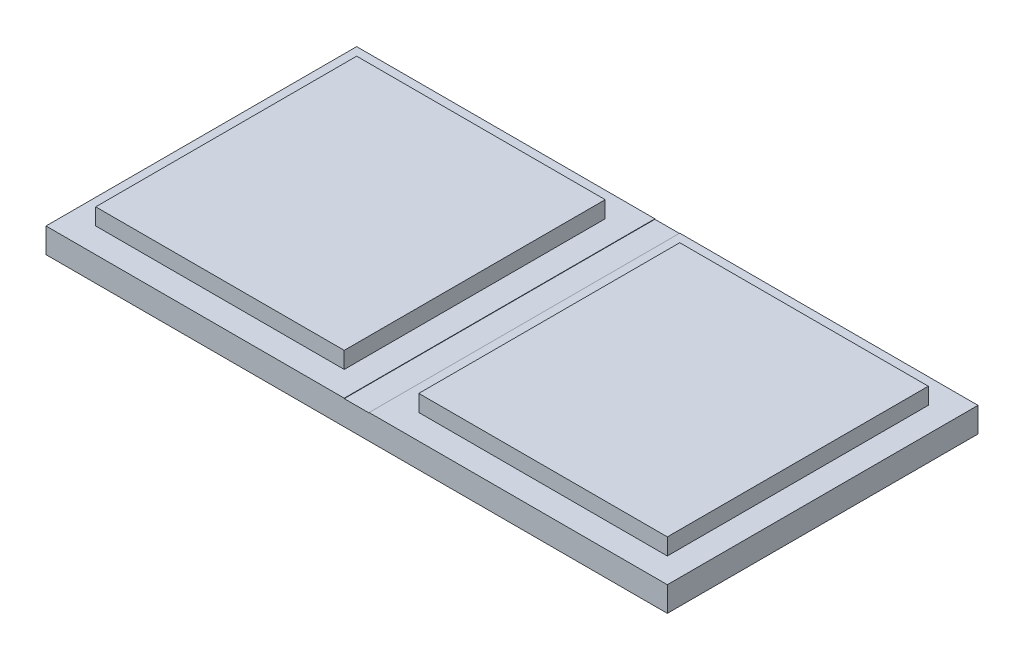
ISO-10303-21;
HEADER;
FILE_DESCRIPTION(('STEP AP214'),'2;1');
FILE_NAME('part.step','',(''),(''),'','','');
FILE_SCHEMA(('AUTOMOTIVE_DESIGN { 1 0 10303 214 1 1 1 1 }'));
ENDSEC;
DATA;
#1=APPLICATION_CONTEXT('core data for automotive mechanical design processes');
#2=APPLICATION_PROTOCOL_DEFINITION('international standard','automotive_design',2000,#1);
#3=PRODUCT_CONTEXT('',#1,'mechanical');
#4=PRODUCT('Part','Part','',(#3));
#5=PRODUCT_RELATED_PRODUCT_CATEGORY('part','',(#4));
#6=PRODUCT_DEFINITION_FORMATION('','',#4);
#7=PRODUCT_DEFINITION_CONTEXT('part definition',#1,'design');
#8=PRODUCT_DEFINITION('design','',#6,#7);
#9=PRODUCT_DEFINITION_SHAPE('','',#8);
#10=(LENGTH_UNIT() NAMED_UNIT(*) SI_UNIT(.MILLI.,.METRE.));
#11=(NAMED_UNIT(*) PLANE_ANGLE_UNIT() SI_UNIT($,.RADIAN.));
#12=(NAMED_UNIT(*) SI_UNIT($,.STERADIAN.) SOLID_ANGLE_UNIT());
#13=UNCERTAINTY_MEASURE_WITH_UNIT(LENGTH_MEASURE(1.E-05),#10,'distance_accuracy_value','');
#14=(GEOMETRIC_REPRESENTATION_CONTEXT(3) GLOBAL_UNCERTAINTY_ASSIGNED_CONTEXT((#13)) GLOBAL_UNIT_ASSIGNED_CONTEXT((#10,
#11,#12)) REPRESENTATION_CONTEXT('',''));
#15=CARTESIAN_POINT('',(0.,0.,0.));
#16=DIRECTION('',(0.,0.,1.));
#17=DIRECTION('',(1.,0.,0.));
#18=AXIS2_PLACEMENT_3D('',#15,#16,#17);
#19=CARTESIAN_POINT('',(0.,1.2,0.));
#20=DIRECTION('',(0.,-1.,0.));
#21=DIRECTION('',(0.,0.,-1.));
#22=AXIS2_PLACEMENT_3D('',#19,#20,#21);
#23=PLANE('',#22);
#24=DIRECTION('',(-1.,0.,0.));
#25=VECTOR('',#24,1.);
#26=CARTESIAN_POINT('',(-15.,1.2,-7.5));
#27=LINE('',#26,#25);
#28=CARTESIAN_POINT('',(15.,1.2,-7.5));
#29=VERTEX_POINT('',#28);
#30=CARTESIAN_POINT('',(0.6,1.2,-7.5));
#31=VERTEX_POINT('',#30);
#32=EDGE_CURVE('E243',#29,#31,#27,.T.);
#33=ORIENTED_EDGE('',*,*,#32,.T.);
#34=DIRECTION('',(0.,0.,-1.));
#35=VECTOR('',#34,1.);
#36=CARTESIAN_POINT('',(0.6,1.2,7.5));
#37=LINE('',#36,#35);
#38=CARTESIAN_POINT('',(0.6,1.2,7.5));
#39=VERTEX_POINT('',#38);
#40=EDGE_CURVE('E211',#39,#31,#37,.T.);
#41=ORIENTED_EDGE('',*,*,#40,.F.);
#42=DIRECTION('',(1.,0.,0.));
#43=VECTOR('',#42,1.);
#44=CARTESIAN_POINT('',(-15.,1.2,7.5));
#45=LINE('',#44,#43);
#46=CARTESIAN_POINT('',(15.,1.2,7.5));
#47=VERTEX_POINT('',#46);
#48=EDGE_CURVE('E248',#39,#47,#45,.T.);
#49=ORIENTED_EDGE('',*,*,#48,.T.);
#50=DIRECTION('',(0.,0.,-1.));
#51=VECTOR('',#50,1.);
#52=CARTESIAN_POINT('',(15.,1.2,7.5));
#53=LINE('',#52,#51);
#54=EDGE_CURVE('E238',#47,#29,#53,.T.);
#55=ORIENTED_EDGE('',*,*,#54,.T.);
#56=EDGE_LOOP('',(#33,#41,#49,#55));
#57=FACE_BOUND('',#56,.T.);
#58=DIRECTION('',(0.,0.,-1.));
#59=VECTOR('',#58,1.);
#60=CARTESIAN_POINT('',(13.8,1.2,6.3));
#61=LINE('',#60,#59);
#62=CARTESIAN_POINT('',(13.8,1.2,6.3));
#63=VERTEX_POINT('',#62);
#64=CARTESIAN_POINT('',(13.8,1.2,-6.3));
#65=VERTEX_POINT('',#64);
#66=EDGE_CURVE('E172',#63,#65,#61,.T.);
#67=ORIENTED_EDGE('',*,*,#66,.F.);
#68=DIRECTION('',(1.,0.,0.));
#69=VECTOR('',#68,1.);
#70=CARTESIAN_POINT('',(1.8,1.2,6.3));
#71=LINE('',#70,#69);
#72=CARTESIAN_POINT('',(1.8,1.2,6.3));
#73=VERTEX_POINT('',#72);
#74=EDGE_CURVE('E169',#73,#63,#71,.T.);
#75=ORIENTED_EDGE('',*,*,#74,.F.);
#76=DIRECTION('',(0.,0.,1.));
#77=VECTOR('',#76,1.);
#78=CARTESIAN_POINT('',(1.8,1.2,-6.3));
#79=LINE('',#78,#77);
#80=CARTESIAN_POINT('',(1.8,1.2,-6.3));
#81=VERTEX_POINT('',#80);
#82=EDGE_CURVE('E59',#81,#73,#79,.T.);
#83=ORIENTED_EDGE('',*,*,#82,.F.);
#84=DIRECTION('',(-1.,0.,0.));
#85=VECTOR('',#84,1.);
#86=CARTESIAN_POINT('',(13.8,1.2,-6.3));
#87=LINE('',#86,#85);
#88=EDGE_CURVE('E54',#65,#81,#87,.T.);
#89=ORIENTED_EDGE('',*,*,#88,.F.);
#90=EDGE_LOOP('',(#67,#75,#83,#89));
#91=FACE_BOUND('',#90,.T.);
#92=ADVANCED_FACE('F39',(#57,#91),#23,.F.);
#93=CARTESIAN_POINT('',(-15.,1.2,7.5));
#94=VERTEX_POINT('',#93);
#95=CARTESIAN_POINT('',(-0.6,1.2,7.5));
#96=VERTEX_POINT('',#95);
#97=EDGE_CURVE('E249',#94,#96,#45,.T.);
#98=ORIENTED_EDGE('',*,*,#97,.T.);
#99=DIRECTION('',(0.,0.,1.));
#100=VECTOR('',#99,1.);
#101=CARTESIAN_POINT('',(-0.6,1.2,7.5));
#102=LINE('',#101,#100);
#103=CARTESIAN_POINT('',(-0.6,1.2,-7.5));
#104=VERTEX_POINT('',#103);
#105=EDGE_CURVE('E216',#104,#96,#102,.T.);
#106=ORIENTED_EDGE('',*,*,#105,.F.);
#107=CARTESIAN_POINT('',(-15.,1.2,-7.5));
#108=VERTEX_POINT('',#107);
#109=EDGE_CURVE('E241',#104,#108,#27,.T.);
#110=ORIENTED_EDGE('',*,*,#109,.T.);
#111=DIRECTION('',(0.,0.,1.));
#112=VECTOR('',#111,1.);
#113=CARTESIAN_POINT('',(-15.,1.2,7.5));
#114=LINE('',#113,#112);
#115=EDGE_CURVE('E246',#108,#94,#114,.T.);
#116=ORIENTED_EDGE('',*,*,#115,.T.);
#117=EDGE_LOOP('',(#98,#106,#110,#116));
#118=FACE_BOUND('',#117,.T.);
#119=DIRECTION('',(0.,0.,1.));
#120=VECTOR('',#119,1.);
#121=CARTESIAN_POINT('',(-13.8,1.2,-6.3));
#122=LINE('',#121,#120);
#123=CARTESIAN_POINT('',(-13.8,1.2,-6.3));
#124=VERTEX_POINT('',#123);
#125=CARTESIAN_POINT('',(-13.8,1.2,6.3));
#126=VERTEX_POINT('',#125);
#127=EDGE_CURVE('E173',#124,#126,#122,.T.);
#128=ORIENTED_EDGE('',*,*,#127,.F.);
#129=DIRECTION('',(-1.,0.,0.));
#130=VECTOR('',#129,1.);
#131=CARTESIAN_POINT('',(-1.8,1.2,-6.3));
#132=LINE('',#131,#130);
#133=CARTESIAN_POINT('',(-1.8,1.2,-6.3));
#134=VERTEX_POINT('',#133);
#135=EDGE_CURVE('E186',#134,#124,#132,.T.);
#136=ORIENTED_EDGE('',*,*,#135,.F.);
#137=DIRECTION('',(0.,0.,-1.));
#138=VECTOR('',#137,1.);
#139=CARTESIAN_POINT('',(-1.8,1.2,6.3));
#140=LINE('',#139,#138);
#141=CARTESIAN_POINT('',(-1.8,1.2,6.3));
#142=VERTEX_POINT('',#141);
#143=EDGE_CURVE('E195',#142,#134,#140,.T.);
#144=ORIENTED_EDGE('',*,*,#143,.F.);
#145=DIRECTION('',(1.,0.,0.));
#146=VECTOR('',#145,1.);
#147=CARTESIAN_POINT('',(-13.8,1.2,6.3));
#148=LINE('',#147,#146);
#149=EDGE_CURVE('E176',#126,#142,#148,.T.);
#150=ORIENTED_EDGE('',*,*,#149,.F.);
#151=EDGE_LOOP('',(#128,#136,#144,#150));
#152=FACE_BOUND('',#151,.T.);
#153=ADVANCED_FACE('F299',(#118,#152),#23,.F.);
#154=CARTESIAN_POINT('',(15.,1.2,7.5));
#155=DIRECTION('',(-1.,0.,0.));
#156=DIRECTION('',(0.,0.,1.));
#157=AXIS2_PLACEMENT_3D('',#154,#155,#156);
#158=PLANE('',#157);
#159=DIRECTION('',(0.,0.,-1.));
#160=VECTOR('',#159,1.);
#161=CARTESIAN_POINT('',(15.,0.,7.5));
#162=LINE('',#161,#160);
#163=CARTESIAN_POINT('',(15.,0.,7.5));
#164=VERTEX_POINT('',#163);
#165=CARTESIAN_POINT('',(15.,0.,-7.5));
#166=VERTEX_POINT('',#165);
#167=EDGE_CURVE('E230',#164,#166,#162,.T.);
#168=ORIENTED_EDGE('',*,*,#167,.T.);
#169=DIRECTION('',(0.,-1.,0.));
#170=VECTOR('',#169,1.);
#171=CARTESIAN_POINT('',(15.,1.2,-7.5));
#172=LINE('',#171,#170);
#173=EDGE_CURVE('E11',#29,#166,#172,.T.);
#174=ORIENTED_EDGE('',*,*,#173,.F.);
#175=ORIENTED_EDGE('',*,*,#54,.F.);
#176=DIRECTION('',(0.,-1.,0.));
#177=VECTOR('',#176,1.);
#178=CARTESIAN_POINT('',(15.,1.2,7.5));
#179=LINE('',#178,#177);
#180=EDGE_CURVE('E252',#47,#164,#179,.T.);
#181=ORIENTED_EDGE('',*,*,#180,.T.);
#182=EDGE_LOOP('',(#168,#174,#175,#181));
#183=FACE_BOUND('',#182,.T.);
#184=ADVANCED_FACE('F41',(#183),#158,.F.);
#185=CARTESIAN_POINT('',(-15.,1.2,-7.5));
#186=DIRECTION('',(0.,0.,1.));
#187=DIRECTION('',(1.,0.,0.));
#188=AXIS2_PLACEMENT_3D('',#185,#186,#187);
#189=PLANE('',#188);
#190=DIRECTION('',(-1.,0.,0.));
#191=VECTOR('',#190,1.);
#192=CARTESIAN_POINT('',(-0.6,1.18,-7.5));
#193=LINE('',#192,#191);
#194=CARTESIAN_POINT('',(0.6,1.18,-7.5));
#195=VERTEX_POINT('',#194);
#196=CARTESIAN_POINT('',(-0.6,1.18,-7.5));
#197=VERTEX_POINT('',#196);
#198=EDGE_CURVE('E215',#195,#197,#193,.T.);
#199=ORIENTED_EDGE('',*,*,#198,.F.);
#200=DIRECTION('',(0.,1.,0.));
#201=VECTOR('',#200,1.);
#202=CARTESIAN_POINT('',(0.6,1.18,-7.5));
#203=LINE('',#202,#201);
#204=EDGE_CURVE('E225',#195,#31,#203,.T.);
#205=ORIENTED_EDGE('',*,*,#204,.T.);
#206=ORIENTED_EDGE('',*,*,#32,.F.);
#207=ORIENTED_EDGE('',*,*,#173,.T.);
#208=DIRECTION('',(-1.,0.,0.));
#209=VECTOR('',#208,1.);
#210=CARTESIAN_POINT('',(-15.,0.,-7.5));
#211=LINE('',#210,#209);
#212=CARTESIAN_POINT('',(-15.,0.,-7.5));
#213=VERTEX_POINT('',#212);
#214=EDGE_CURVE('E255',#166,#213,#211,.T.);
#215=ORIENTED_EDGE('',*,*,#214,.T.);
#216=DIRECTION('',(0.,-1.,0.));
#217=VECTOR('',#216,1.);
#218=CARTESIAN_POINT('',(-15.,1.2,-7.5));
#219=LINE('',#218,#217);
#220=EDGE_CURVE('E47',#108,#213,#219,.T.);
#221=ORIENTED_EDGE('',*,*,#220,.F.);
#222=ORIENTED_EDGE('',*,*,#109,.F.);
#223=DIRECTION('',(0.,1.,0.));
#224=VECTOR('',#223,1.);
#225=CARTESIAN_POINT('',(-0.6,1.18,-7.5));
#226=LINE('',#225,#224);
#227=EDGE_CURVE('E234',#197,#104,#226,.T.);
#228=ORIENTED_EDGE('',*,*,#227,.F.);
#229=EDGE_LOOP('',(#199,#205,#206,#207,#215,#221,#222,#228));
#230=FACE_BOUND('',#229,.T.);
#231=ADVANCED_FACE('F301',(#230),#189,.F.);
#232=CARTESIAN_POINT('',(-15.,1.2,7.5));
#233=DIRECTION('',(1.,0.,0.));
#234=DIRECTION('',(0.,0.,-1.));
#235=AXIS2_PLACEMENT_3D('',#232,#233,#234);
#236=PLANE('',#235);
#237=DIRECTION('',(0.,0.,1.));
#238=VECTOR('',#237,1.);
#239=CARTESIAN_POINT('',(-15.,0.,7.5));
#240=LINE('',#239,#238);
#241=CARTESIAN_POINT('',(-15.,0.,7.5));
#242=VERTEX_POINT('',#241);
#243=EDGE_CURVE('E257',#213,#242,#240,.T.);
#244=ORIENTED_EDGE('',*,*,#243,.T.);
#245=DIRECTION('',(0.,-1.,0.));
#246=VECTOR('',#245,1.);
#247=CARTESIAN_POINT('',(-15.,1.2,7.5));
#248=LINE('',#247,#246);
#249=EDGE_CURVE('E262',#94,#242,#248,.T.);
#250=ORIENTED_EDGE('',*,*,#249,.F.);
#251=ORIENTED_EDGE('',*,*,#115,.F.);
#252=ORIENTED_EDGE('',*,*,#220,.T.);
#253=EDGE_LOOP('',(#244,#250,#251,#252));
#254=FACE_BOUND('',#253,.T.);
#255=ADVANCED_FACE('F269',(#254),#236,.F.);
#256=CARTESIAN_POINT('',(-15.,1.2,7.5));
#257=DIRECTION('',(0.,0.,-1.));
#258=DIRECTION('',(-1.,0.,0.));
#259=AXIS2_PLACEMENT_3D('',#256,#257,#258);
#260=PLANE('',#259);
#261=ORIENTED_EDGE('',*,*,#48,.F.);
#262=DIRECTION('',(0.,1.,0.));
#263=VECTOR('',#262,1.);
#264=CARTESIAN_POINT('',(0.6,1.18,7.5));
#265=LINE('',#264,#263);
#266=CARTESIAN_POINT('',(0.6,1.18,7.5));
#267=VERTEX_POINT('',#266);
#268=EDGE_CURVE('E228',#267,#39,#265,.T.);
#269=ORIENTED_EDGE('',*,*,#268,.F.);
#270=DIRECTION('',(1.,0.,0.));
#271=VECTOR('',#270,1.);
#272=CARTESIAN_POINT('',(-0.6,1.18,7.5));
#273=LINE('',#272,#271);
#274=CARTESIAN_POINT('',(-0.6,1.18,7.5));
#275=VERTEX_POINT('',#274);
#276=EDGE_CURVE('E222',#275,#267,#273,.T.);
#277=ORIENTED_EDGE('',*,*,#276,.F.);
#278=DIRECTION('',(0.,1.,0.));
#279=VECTOR('',#278,1.);
#280=CARTESIAN_POINT('',(-0.6,1.18,7.5));
#281=LINE('',#280,#279);
#282=EDGE_CURVE('E231',#275,#96,#281,.T.);
#283=ORIENTED_EDGE('',*,*,#282,.T.);
#284=ORIENTED_EDGE('',*,*,#97,.F.);
#285=ORIENTED_EDGE('',*,*,#249,.T.);
#286=DIRECTION('',(1.,0.,0.));
#287=VECTOR('',#286,1.);
#288=CARTESIAN_POINT('',(-15.,0.,7.5));
#289=LINE('',#288,#287);
#290=EDGE_CURVE('E242',#242,#164,#289,.T.);
#291=ORIENTED_EDGE('',*,*,#290,.T.);
#292=ORIENTED_EDGE('',*,*,#180,.F.);
#293=EDGE_LOOP('',(#261,#269,#277,#283,#284,#285,#291,#292));
#294=FACE_BOUND('',#293,.T.);
#295=ADVANCED_FACE('F280',(#294),#260,.F.);
#296=CARTESIAN_POINT('',(0.,0.,0.));
#297=DIRECTION('',(0.,-1.,0.));
#298=DIRECTION('',(0.,0.,-1.));
#299=AXIS2_PLACEMENT_3D('',#296,#297,#298);
#300=PLANE('',#299);
#301=ORIENTED_EDGE('',*,*,#167,.F.);
#302=ORIENTED_EDGE('',*,*,#290,.F.);
#303=ORIENTED_EDGE('',*,*,#243,.F.);
#304=ORIENTED_EDGE('',*,*,#214,.F.);
#305=EDGE_LOOP('',(#301,#302,#303,#304));
#306=FACE_BOUND('',#305,.T.);
#307=ADVANCED_FACE('F276',(#306),#300,.T.);
#308=CARTESIAN_POINT('',(0.6,1.18,7.5));
#309=DIRECTION('',(1.,0.,0.));
#310=DIRECTION('',(0.,0.,-1.));
#311=AXIS2_PLACEMENT_3D('',#308,#309,#310);
#312=PLANE('',#311);
#313=ORIENTED_EDGE('',*,*,#40,.T.);
#314=ORIENTED_EDGE('',*,*,#204,.F.);
#315=DIRECTION('',(0.,0.,-1.));
#316=VECTOR('',#315,1.);
#317=CARTESIAN_POINT('',(0.6,1.18,7.5));
#318=LINE('',#317,#316);
#319=EDGE_CURVE('E212',#267,#195,#318,.T.);
#320=ORIENTED_EDGE('',*,*,#319,.F.);
#321=ORIENTED_EDGE('',*,*,#268,.T.);
#322=EDGE_LOOP('',(#313,#314,#320,#321));
#323=FACE_BOUND('',#322,.T.);
#324=ADVANCED_FACE('F290',(#323),#312,.F.);
#325=CARTESIAN_POINT('',(-0.6,1.18,7.5));
#326=DIRECTION('',(-1.,0.,0.));
#327=DIRECTION('',(0.,0.,1.));
#328=AXIS2_PLACEMENT_3D('',#325,#326,#327);
#329=PLANE('',#328);
#330=ORIENTED_EDGE('',*,*,#105,.T.);
#331=ORIENTED_EDGE('',*,*,#282,.F.);
#332=DIRECTION('',(0.,0.,1.));
#333=VECTOR('',#332,1.);
#334=CARTESIAN_POINT('',(-0.6,1.18,7.5));
#335=LINE('',#334,#333);
#336=EDGE_CURVE('E219',#197,#275,#335,.T.);
#337=ORIENTED_EDGE('',*,*,#336,.F.);
#338=ORIENTED_EDGE('',*,*,#227,.T.);
#339=EDGE_LOOP('',(#330,#331,#337,#338));
#340=FACE_BOUND('',#339,.T.);
#341=ADVANCED_FACE('F296',(#340),#329,.F.);
#342=CARTESIAN_POINT('',(0.,1.18,0.));
#343=DIRECTION('',(0.,-1.,0.));
#344=DIRECTION('',(0.,0.,-1.));
#345=AXIS2_PLACEMENT_3D('',#342,#343,#344);
#346=PLANE('',#345);
#347=ORIENTED_EDGE('',*,*,#319,.T.);
#348=ORIENTED_EDGE('',*,*,#198,.T.);
#349=ORIENTED_EDGE('',*,*,#336,.T.);
#350=ORIENTED_EDGE('',*,*,#276,.T.);
#351=EDGE_LOOP('',(#347,#348,#349,#350));
#352=FACE_BOUND('',#351,.T.);
#353=ADVANCED_FACE('F293',(#352),#346,.F.);
#354=CARTESIAN_POINT('',(-13.8,2.,-6.3));
#355=DIRECTION('',(1.,0.,0.));
#356=DIRECTION('',(0.,0.,-1.));
#357=AXIS2_PLACEMENT_3D('',#354,#355,#356);
#358=PLANE('',#357);
#359=ORIENTED_EDGE('',*,*,#127,.T.);
#360=DIRECTION('',(0.,-1.,0.));
#361=VECTOR('',#360,1.);
#362=CARTESIAN_POINT('',(-13.8,2.,6.3));
#363=LINE('',#362,#361);
#364=CARTESIAN_POINT('',(-13.8,2.,6.3));
#365=VERTEX_POINT('',#364);
#366=EDGE_CURVE('E208',#365,#126,#363,.T.);
#367=ORIENTED_EDGE('',*,*,#366,.F.);
#368=DIRECTION('',(0.,0.,1.));
#369=VECTOR('',#368,1.);
#370=CARTESIAN_POINT('',(-13.8,2.,-6.3));
#371=LINE('',#370,#369);
#372=CARTESIAN_POINT('',(-13.8,2.,-6.3));
#373=VERTEX_POINT('',#372);
#374=EDGE_CURVE('E182',#373,#365,#371,.T.);
#375=ORIENTED_EDGE('',*,*,#374,.F.);
#376=DIRECTION('',(0.,-1.,0.));
#377=VECTOR('',#376,1.);
#378=CARTESIAN_POINT('',(-13.8,2.,-6.3));
#379=LINE('',#378,#377);
#380=EDGE_CURVE('E191',#373,#124,#379,.T.);
#381=ORIENTED_EDGE('',*,*,#380,.T.);
#382=EDGE_LOOP('',(#359,#367,#375,#381));
#383=FACE_BOUND('',#382,.T.);
#384=ADVANCED_FACE('F343',(#383),#358,.F.);
#385=CARTESIAN_POINT('',(-13.8,2.,6.3));
#386=DIRECTION('',(0.,0.,-1.));
#387=DIRECTION('',(-1.,0.,0.));
#388=AXIS2_PLACEMENT_3D('',#385,#386,#387);
#389=PLANE('',#388);
#390=ORIENTED_EDGE('',*,*,#149,.T.);
#391=DIRECTION('',(0.,-1.,0.));
#392=VECTOR('',#391,1.);
#393=CARTESIAN_POINT('',(-1.8,2.,6.3));
#394=LINE('',#393,#392);
#395=CARTESIAN_POINT('',(-1.8,2.,6.3));
#396=VERTEX_POINT('',#395);
#397=EDGE_CURVE('E205',#396,#142,#394,.T.);
#398=ORIENTED_EDGE('',*,*,#397,.F.);
#399=DIRECTION('',(1.,0.,0.));
#400=VECTOR('',#399,1.);
#401=CARTESIAN_POINT('',(-13.8,2.,6.3));
#402=LINE('',#401,#400);
#403=EDGE_CURVE('E185',#365,#396,#402,.T.);
#404=ORIENTED_EDGE('',*,*,#403,.F.);
#405=ORIENTED_EDGE('',*,*,#366,.T.);
#406=EDGE_LOOP('',(#390,#398,#404,#405));
#407=FACE_BOUND('',#406,.T.);
#408=ADVANCED_FACE('F357',(#407),#389,.F.);
#409=CARTESIAN_POINT('',(-1.8,2.,6.3));
#410=DIRECTION('',(-1.,0.,0.));
#411=DIRECTION('',(0.,0.,1.));
#412=AXIS2_PLACEMENT_3D('',#409,#410,#411);
#413=PLANE('',#412);
#414=ORIENTED_EDGE('',*,*,#143,.T.);
#415=DIRECTION('',(0.,-1.,0.));
#416=VECTOR('',#415,1.);
#417=CARTESIAN_POINT('',(-1.8,2.,-6.3));
#418=LINE('',#417,#416);
#419=CARTESIAN_POINT('',(-1.8,2.,-6.3));
#420=VERTEX_POINT('',#419);
#421=EDGE_CURVE('E202',#420,#134,#418,.T.);
#422=ORIENTED_EDGE('',*,*,#421,.F.);
#423=DIRECTION('',(0.,0.,-1.));
#424=VECTOR('',#423,1.);
#425=CARTESIAN_POINT('',(-1.8,2.,6.3));
#426=LINE('',#425,#424);
#427=EDGE_CURVE('E188',#396,#420,#426,.T.);
#428=ORIENTED_EDGE('',*,*,#427,.F.);
#429=ORIENTED_EDGE('',*,*,#397,.T.);
#430=EDGE_LOOP('',(#414,#422,#428,#429));
#431=FACE_BOUND('',#430,.T.);
#432=ADVANCED_FACE('F365',(#431),#413,.F.);
#433=CARTESIAN_POINT('',(-1.8,2.,-6.3));
#434=DIRECTION('',(0.,0.,1.));
#435=DIRECTION('',(1.,0.,0.));
#436=AXIS2_PLACEMENT_3D('',#433,#434,#435);
#437=PLANE('',#436);
#438=ORIENTED_EDGE('',*,*,#135,.T.);
#439=ORIENTED_EDGE('',*,*,#380,.F.);
#440=DIRECTION('',(-1.,0.,0.));
#441=VECTOR('',#440,1.);
#442=CARTESIAN_POINT('',(-1.8,2.,-6.3));
#443=LINE('',#442,#441);
#444=EDGE_CURVE('E190',#420,#373,#443,.T.);
#445=ORIENTED_EDGE('',*,*,#444,.F.);
#446=ORIENTED_EDGE('',*,*,#421,.T.);
#447=EDGE_LOOP('',(#438,#439,#445,#446));
#448=FACE_BOUND('',#447,.T.);
#449=ADVANCED_FACE('F374',(#448),#437,.F.);
#450=CARTESIAN_POINT('',(0.,2.,0.));
#451=DIRECTION('',(0.,1.,0.));
#452=DIRECTION('',(0.,0.,1.));
#453=AXIS2_PLACEMENT_3D('',#450,#451,#452);
#454=PLANE('',#453);
#455=ORIENTED_EDGE('',*,*,#374,.T.);
#456=ORIENTED_EDGE('',*,*,#403,.T.);
#457=ORIENTED_EDGE('',*,*,#427,.T.);
#458=ORIENTED_EDGE('',*,*,#444,.T.);
#459=EDGE_LOOP('',(#455,#456,#457,#458));
#460=FACE_BOUND('',#459,.T.);
#461=ADVANCED_FACE('F382',(#460),#454,.T.);
#462=CARTESIAN_POINT('',(13.8,2.,6.3));
#463=DIRECTION('',(-1.,0.,0.));
#464=DIRECTION('',(0.,0.,1.));
#465=AXIS2_PLACEMENT_3D('',#462,#463,#464);
#466=PLANE('',#465);
#467=ORIENTED_EDGE('',*,*,#66,.T.);
#468=DIRECTION('',(0.,-1.,0.));
#469=VECTOR('',#468,1.);
#470=CARTESIAN_POINT('',(13.8,2.,-6.3));
#471=LINE('',#470,#469);
#472=CARTESIAN_POINT('',(13.8,2.,-6.3));
#473=VERTEX_POINT('',#472);
#474=EDGE_CURVE('E153',#473,#65,#471,.T.);
#475=ORIENTED_EDGE('',*,*,#474,.F.);
#476=DIRECTION('',(0.,0.,-1.));
#477=VECTOR('',#476,1.);
#478=CARTESIAN_POINT('',(13.8,2.,6.3));
#479=LINE('',#478,#477);
#480=CARTESIAN_POINT('',(13.8,2.,6.3));
#481=VERTEX_POINT('',#480);
#482=EDGE_CURVE('E160',#481,#473,#479,.T.);
#483=ORIENTED_EDGE('',*,*,#482,.F.);
#484=DIRECTION('',(0.,-1.,0.));
#485=VECTOR('',#484,1.);
#486=CARTESIAN_POINT('',(13.8,2.,6.3));
#487=LINE('',#486,#485);
#488=EDGE_CURVE('E445',#481,#63,#487,.T.);
#489=ORIENTED_EDGE('',*,*,#488,.T.);
#490=EDGE_LOOP('',(#467,#475,#483,#489));
#491=FACE_BOUND('',#490,.T.);
#492=ADVANCED_FACE('F171',(#491),#466,.F.);
#493=CARTESIAN_POINT('',(13.8,2.,-6.3));
#494=DIRECTION('',(0.,0.,1.));
#495=DIRECTION('',(1.,0.,0.));
#496=AXIS2_PLACEMENT_3D('',#493,#494,#495);
#497=PLANE('',#496);
#498=ORIENTED_EDGE('',*,*,#88,.T.);
#499=DIRECTION('',(0.,-1.,0.));
#500=VECTOR('',#499,1.);
#501=CARTESIAN_POINT('',(1.8,2.,-6.3));
#502=LINE('',#501,#500);
#503=CARTESIAN_POINT('',(1.8,2.,-6.3));
#504=VERTEX_POINT('',#503);
#505=EDGE_CURVE('E156',#504,#81,#502,.T.);
#506=ORIENTED_EDGE('',*,*,#505,.F.);
#507=DIRECTION('',(-1.,0.,0.));
#508=VECTOR('',#507,1.);
#509=CARTESIAN_POINT('',(13.8,2.,-6.3));
#510=LINE('',#509,#508);
#511=EDGE_CURVE('E149',#473,#504,#510,.T.);
#512=ORIENTED_EDGE('',*,*,#511,.F.);
#513=ORIENTED_EDGE('',*,*,#474,.T.);
#514=EDGE_LOOP('',(#498,#506,#512,#513));
#515=FACE_BOUND('',#514,.T.);
#516=ADVANCED_FACE('F151',(#515),#497,.F.);
#517=CARTESIAN_POINT('',(1.8,2.,-6.3));
#518=DIRECTION('',(1.,0.,0.));
#519=DIRECTION('',(0.,0.,-1.));
#520=AXIS2_PLACEMENT_3D('',#517,#518,#519);
#521=PLANE('',#520);
#522=ORIENTED_EDGE('',*,*,#82,.T.);
#523=DIRECTION('',(0.,-1.,0.));
#524=VECTOR('',#523,1.);
#525=CARTESIAN_POINT('',(1.8,2.,6.3));
#526=LINE('',#525,#524);
#527=CARTESIAN_POINT('',(1.8,2.,6.3));
#528=VERTEX_POINT('',#527);
#529=EDGE_CURVE('E178',#528,#73,#526,.T.);
#530=ORIENTED_EDGE('',*,*,#529,.F.);
#531=DIRECTION('',(0.,0.,1.));
#532=VECTOR('',#531,1.);
#533=CARTESIAN_POINT('',(1.8,2.,-6.3));
#534=LINE('',#533,#532);
#535=EDGE_CURVE('E159',#504,#528,#534,.T.);
#536=ORIENTED_EDGE('',*,*,#535,.F.);
#537=ORIENTED_EDGE('',*,*,#505,.T.);
#538=EDGE_LOOP('',(#522,#530,#536,#537));
#539=FACE_BOUND('',#538,.T.);
#540=ADVANCED_FACE('F413',(#539),#521,.F.);
#541=CARTESIAN_POINT('',(1.8,2.,6.3));
#542=DIRECTION('',(0.,0.,-1.));
#543=DIRECTION('',(-1.,0.,0.));
#544=AXIS2_PLACEMENT_3D('',#541,#542,#543);
#545=PLANE('',#544);
#546=ORIENTED_EDGE('',*,*,#74,.T.);
#547=ORIENTED_EDGE('',*,*,#488,.F.);
#548=DIRECTION('',(1.,0.,0.));
#549=VECTOR('',#548,1.);
#550=CARTESIAN_POINT('',(1.8,2.,6.3));
#551=LINE('',#550,#549);
#552=EDGE_CURVE('E165',#528,#481,#551,.T.);
#553=ORIENTED_EDGE('',*,*,#552,.F.);
#554=ORIENTED_EDGE('',*,*,#529,.T.);
#555=EDGE_LOOP('',(#546,#547,#553,#554));
#556=FACE_BOUND('',#555,.T.);
#557=ADVANCED_FACE('F422',(#556),#545,.F.);
#558=CARTESIAN_POINT('',(0.,2.,0.));
#559=DIRECTION('',(0.,1.,0.));
#560=DIRECTION('',(0.,0.,1.));
#561=AXIS2_PLACEMENT_3D('',#558,#559,#560);
#562=PLANE('',#561);
#563=ORIENTED_EDGE('',*,*,#482,.T.);
#564=ORIENTED_EDGE('',*,*,#511,.T.);
#565=ORIENTED_EDGE('',*,*,#535,.T.);
#566=ORIENTED_EDGE('',*,*,#552,.T.);
#567=EDGE_LOOP('',(#563,#564,#565,#566));
#568=FACE_BOUND('',#567,.T.);
#569=ADVANCED_FACE('F163',(#568),#562,.T.);
#570=CLOSED_SHELL('',(#92,#153,#184,#231,#255,#295,#307,#324,#341,#353,#384,#408,#432,#449,#461,
#492,#516,#540,#557,#569));
#571=MANIFOLD_SOLID_BREP('B2',#570);
#572=ADVANCED_BREP_SHAPE_REPRESENTATION('',(#18,#571),#14);
#573=SHAPE_DEFINITION_REPRESENTATION(#9,#572);
ENDSEC;
END-ISO-10303-21;
